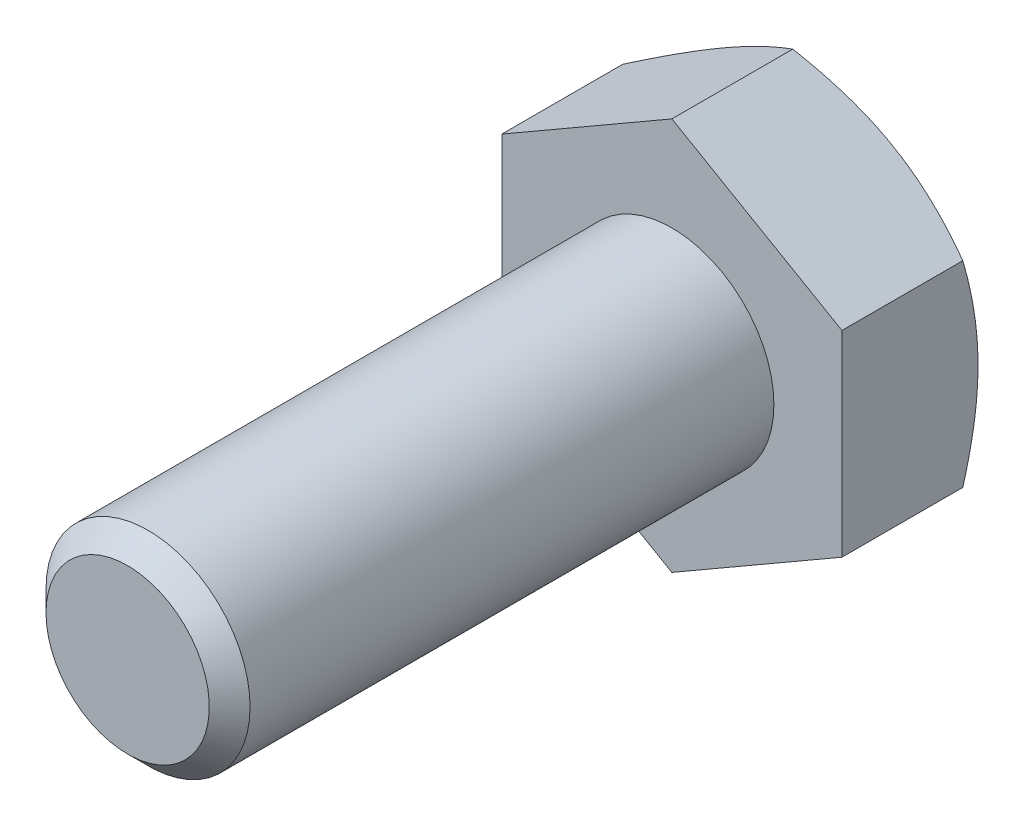
ISO-10303-21;
HEADER;
FILE_DESCRIPTION(('STEP AP214'),'2;1');
FILE_NAME('part.step','',(''),(''),'','','');
FILE_SCHEMA(('AUTOMOTIVE_DESIGN { 1 0 10303 214 1 1 1 1 }'));
ENDSEC;
DATA;
#1=APPLICATION_CONTEXT('core data for automotive mechanical design processes');
#2=APPLICATION_PROTOCOL_DEFINITION('international standard','automotive_design',2000,#1);
#3=PRODUCT_CONTEXT('',#1,'mechanical');
#4=PRODUCT('Part','Part','',(#3));
#5=PRODUCT_RELATED_PRODUCT_CATEGORY('part','',(#4));
#6=PRODUCT_DEFINITION_FORMATION('','',#4);
#7=PRODUCT_DEFINITION_CONTEXT('part definition',#1,'design');
#8=PRODUCT_DEFINITION('design','',#6,#7);
#9=PRODUCT_DEFINITION_SHAPE('','',#8);
#10=(LENGTH_UNIT() NAMED_UNIT(*) SI_UNIT(.MILLI.,.METRE.));
#11=(NAMED_UNIT(*) PLANE_ANGLE_UNIT() SI_UNIT($,.RADIAN.));
#12=(NAMED_UNIT(*) SI_UNIT($,.STERADIAN.) SOLID_ANGLE_UNIT());
#13=UNCERTAINTY_MEASURE_WITH_UNIT(LENGTH_MEASURE(1.E-05),#10,'distance_accuracy_value','');
#14=(GEOMETRIC_REPRESENTATION_CONTEXT(3) GLOBAL_UNCERTAINTY_ASSIGNED_CONTEXT((#13)) GLOBAL_UNIT_ASSIGNED_CONTEXT((#10,
#11,#12)) REPRESENTATION_CONTEXT('',''));
#15=CARTESIAN_POINT('',(0.,0.,0.));
#16=DIRECTION('',(0.,0.,1.));
#17=DIRECTION('',(1.,0.,0.));
#18=AXIS2_PLACEMENT_3D('',#15,#16,#17);
#19=CARTESIAN_POINT('',(0.,0.,16.));
#20=DIRECTION('',(0.,0.,1.));
#21=DIRECTION('',(1.,0.,0.));
#22=AXIS2_PLACEMENT_3D('',#19,#20,#21);
#23=PLANE('',#22);
#24=CARTESIAN_POINT('',(0.,0.,16.));
#25=DIRECTION('',(0.,0.,1.));
#26=DIRECTION('',(1.,0.,0.));
#27=AXIS2_PLACEMENT_3D('',#24,#25,#26);
#28=CIRCLE('',#27,2.4);
#29=CARTESIAN_POINT('',(-2.4,0.,16.));
#30=VERTEX_POINT('',#29);
#31=EDGE_CURVE('E215',#30,#30,#28,.T.);
#32=ORIENTED_EDGE('',*,*,#31,.T.);
#33=EDGE_LOOP('',(#32));
#34=FACE_BOUND('',#33,.T.);
#35=ADVANCED_FACE('F35',(#34),#23,.T.);
#36=CARTESIAN_POINT('',(0.,0.,0.));
#37=DIRECTION('',(0.,0.,1.));
#38=DIRECTION('',(1.,0.,0.));
#39=AXIS2_PLACEMENT_3D('',#36,#37,#38);
#40=CYLINDRICAL_SURFACE('',#39,3.);
#41=CARTESIAN_POINT('',(0.,0.,15.4));
#42=DIRECTION('',(0.,0.,1.));
#43=DIRECTION('',(1.,0.,0.));
#44=AXIS2_PLACEMENT_3D('',#41,#42,#43);
#45=CIRCLE('',#44,3.);
#46=CARTESIAN_POINT('',(-3.,0.,15.4));
#47=VERTEX_POINT('',#46);
#48=EDGE_CURVE('E217',#47,#47,#45,.F.);
#49=ORIENTED_EDGE('',*,*,#48,.T.);
#50=EDGE_LOOP('',(#49));
#51=FACE_BOUND('',#50,.T.);
#52=CARTESIAN_POINT('',(0.,0.,0.));
#53=DIRECTION('',(0.,0.,1.));
#54=DIRECTION('',(1.,0.,0.));
#55=AXIS2_PLACEMENT_3D('',#52,#53,#54);
#56=CIRCLE('',#55,3.);
#57=CARTESIAN_POINT('',(3.,0.,0.));
#58=VERTEX_POINT('',#57);
#59=EDGE_CURVE('E218',#58,#58,#56,.F.);
#60=ORIENTED_EDGE('',*,*,#59,.F.);
#61=EDGE_LOOP('',(#60));
#62=FACE_BOUND('',#61,.T.);
#63=ADVANCED_FACE('F206',(#51,#62),#40,.T.);
#64=CARTESIAN_POINT('',(0.,0.,16.));
#65=DIRECTION('',(0.,0.,-1.));
#66=DIRECTION('',(-1.,0.,0.));
#67=AXIS2_PLACEMENT_3D('',#64,#65,#66);
#68=CONICAL_SURFACE('',#67,2.4,0.785398163397446);
#69=CARTESIAN_POINT('',(-3.,0.,15.4));
#70=CARTESIAN_POINT('',(-2.99375,0.,15.40625));
#71=CARTESIAN_POINT('',(-2.9875,0.,15.4125));
#72=CARTESIAN_POINT('',(-2.975,0.,15.425));
#73=CARTESIAN_POINT('',(-2.96875,0.,15.43125));
#74=CARTESIAN_POINT('',(-2.95625,0.,15.44375));
#75=CARTESIAN_POINT('',(-2.95,0.,15.45));
#76=CARTESIAN_POINT('',(-2.9375,0.,15.4625));
#77=CARTESIAN_POINT('',(-2.93125,0.,15.46875));
#78=CARTESIAN_POINT('',(-2.91875,0.,15.48125));
#79=CARTESIAN_POINT('',(-2.9125,0.,15.4875));
#80=CARTESIAN_POINT('',(-2.9,0.,15.5));
#81=CARTESIAN_POINT('',(-2.89375,0.,15.50625));
#82=CARTESIAN_POINT('',(-2.88125,0.,15.51875));
#83=CARTESIAN_POINT('',(-2.875,0.,15.525));
#84=CARTESIAN_POINT('',(-2.8625,0.,15.5375));
#85=CARTESIAN_POINT('',(-2.85625,0.,15.54375));
#86=CARTESIAN_POINT('',(-2.84375,0.,15.55625));
#87=CARTESIAN_POINT('',(-2.8375,0.,15.5625));
#88=CARTESIAN_POINT('',(-2.825,0.,15.575));
#89=CARTESIAN_POINT('',(-2.81875,0.,15.58125));
#90=CARTESIAN_POINT('',(-2.80625,0.,15.59375));
#91=CARTESIAN_POINT('',(-2.8,0.,15.6));
#92=CARTESIAN_POINT('',(-2.7875,0.,15.6125));
#93=CARTESIAN_POINT('',(-2.78125,0.,15.61875));
#94=CARTESIAN_POINT('',(-2.76875,0.,15.63125));
#95=CARTESIAN_POINT('',(-2.7625,0.,15.6375));
#96=CARTESIAN_POINT('',(-2.75,0.,15.65));
#97=CARTESIAN_POINT('',(-2.74375,0.,15.65625));
#98=CARTESIAN_POINT('',(-2.73125,0.,15.66875));
#99=CARTESIAN_POINT('',(-2.725,0.,15.675));
#100=CARTESIAN_POINT('',(-2.7125,0.,15.6875));
#101=CARTESIAN_POINT('',(-2.70625,0.,15.69375));
#102=CARTESIAN_POINT('',(-2.69375,0.,15.70625));
#103=CARTESIAN_POINT('',(-2.6875,0.,15.7125));
#104=CARTESIAN_POINT('',(-2.675,0.,15.725));
#105=CARTESIAN_POINT('',(-2.66875,0.,15.73125));
#106=CARTESIAN_POINT('',(-2.65625,0.,15.74375));
#107=CARTESIAN_POINT('',(-2.65,0.,15.75));
#108=CARTESIAN_POINT('',(-2.6375,0.,15.7625));
#109=CARTESIAN_POINT('',(-2.63125,0.,15.76875));
#110=CARTESIAN_POINT('',(-2.61875,0.,15.78125));
#111=CARTESIAN_POINT('',(-2.6125,0.,15.7875));
#112=CARTESIAN_POINT('',(-2.6,0.,15.8));
#113=CARTESIAN_POINT('',(-2.59375,0.,15.80625));
#114=CARTESIAN_POINT('',(-2.58125,0.,15.81875));
#115=CARTESIAN_POINT('',(-2.575,0.,15.825));
#116=CARTESIAN_POINT('',(-2.5625,0.,15.8375));
#117=CARTESIAN_POINT('',(-2.55625,0.,15.84375));
#118=CARTESIAN_POINT('',(-2.54375,0.,15.85625));
#119=CARTESIAN_POINT('',(-2.5375,0.,15.8625));
#120=CARTESIAN_POINT('',(-2.525,0.,15.875));
#121=CARTESIAN_POINT('',(-2.51875,0.,15.88125));
#122=CARTESIAN_POINT('',(-2.50625,0.,15.89375));
#123=CARTESIAN_POINT('',(-2.5,0.,15.9));
#124=CARTESIAN_POINT('',(-2.4875,0.,15.9125));
#125=CARTESIAN_POINT('',(-2.48125,0.,15.91875));
#126=CARTESIAN_POINT('',(-2.46875,0.,15.93125));
#127=CARTESIAN_POINT('',(-2.4625,0.,15.9375));
#128=CARTESIAN_POINT('',(-2.45,0.,15.95));
#129=CARTESIAN_POINT('',(-2.44375,0.,15.95625));
#130=CARTESIAN_POINT('',(-2.43125,0.,15.96875));
#131=CARTESIAN_POINT('',(-2.425,0.,15.975));
#132=CARTESIAN_POINT('',(-2.4125,0.,15.9875));
#133=CARTESIAN_POINT('',(-2.40625,0.,15.99375));
#134=CARTESIAN_POINT('',(-2.4,0.,16.));
#135=B_SPLINE_CURVE_WITH_KNOTS('',3,(#69,#70,#71,#72,#73,#74,#75,#76,#77,#78,#79,#80,#81,#82,
#83,#84,#85,#86,#87,#88,#89,#90,#91,#92,#93,#94,#95,#96,#97,#98,#99,#100,#101,#102,#103,#104,
#105,#106,#107,#108,#109,#110,#111,#112,#113,#114,#115,#116,#117,#118,#119,#120,#121,#122,#123,
#124,#125,#126,#127,#128,#129,#130,#131,#132,#133,#134),.UNSPECIFIED.,.F.,.F.,(4,2,2,2,2,2,2,2,
2,2,2,2,2,2,2,2,2,2,2,2,2,2,2,2,2,2,2,2,2,2,2,2,4),(0.,0.0265165042944963,0.0530330085889917,
0.079549512883487,0.106066017177982,0.132582521472479,0.159099025766974,0.185615530061469,
0.212132034355965,0.238648538650461,0.265165042944957,0.291681547239452,0.318198051533947,
0.344714555828444,0.371231060122938,0.397747564417434,0.424264068711931,0.450780573006425,
0.477297077300921,0.503813581595415,0.530330085889912,0.556846590184409,0.583363094478903,
0.609879598773399,0.636396103067896,0.66291260736239,0.689429111656886,0.71594561595138,
0.742462120245877,0.768978624540374,0.795495128834868,0.822011633129364,0.848528137423858),.UNSPECIFIED.);
#136=EDGE_CURVE('BSEAM211',#47,#30,#135,.T.);
#137=ORIENTED_EDGE('',*,*,#48,.F.);
#138=ORIENTED_EDGE('',*,*,#31,.F.);
#139=ORIENTED_EDGE('',*,*,#136,.T.);
#140=ORIENTED_EDGE('',*,*,#136,.F.);
#141=EDGE_LOOP('',(#137,#139,#138,#140));
#142=FACE_BOUND('',#141,.T.);
#143=ADVANCED_FACE('F211',(#142),#68,.T.);
#144=CARTESIAN_POINT('',(0.,5.77350269189627,-4.));
#145=DIRECTION('',(0.499999999999998,0.86602540378444,0.));
#146=DIRECTION('',(-0.86602540378444,0.499999999999998,0.));
#147=AXIS2_PLACEMENT_3D('',#144,#145,#146);
#148=PLANE('',#147);
#149=CARTESIAN_POINT('',(-0.000200000000025221,5.77361816195011,-3.55335134394816));
#150=CARTESIAN_POINT('',(0.219534594525161,5.64675433465072,-3.62661343236236));
#151=CARTESIAN_POINT('',(0.441148584459558,5.51880543790591,-3.6932486780819));
#152=CARTESIAN_POINT('',(0.888213995453493,5.26069210252319,-3.80956100898919));
#153=CARTESIAN_POINT('',(1.11367335959075,5.13052307794722,-3.85919695008421));
#154=CARTESIAN_POINT('',(1.56183230522349,4.87177839004642,-3.9364489745813));
#155=CARTESIAN_POINT('',(1.78446209310418,4.74324302208388,-3.96457962171651));
#156=CARTESIAN_POINT('',(2.11918990184663,4.54998783160117,-3.98980507804632));
#157=CARTESIAN_POINT('',(2.23084219680505,4.48552534905129,-3.99538654023052));
#158=CARTESIAN_POINT('',(2.45424997067378,4.35654081066912,-4.00079778324853));
#159=CARTESIAN_POINT('',(2.5660054462903,4.29201875673851,-4.0006277417418));
#160=CARTESIAN_POINT('',(2.87218423085063,4.11524635305245,-3.99224636820796));
#161=CARTESIAN_POINT('',(3.0665060859672,4.00305457769147,-3.97817022810275));
#162=CARTESIAN_POINT('',(3.4538601019977,3.77941563226459,-3.93353474289057));
#163=CARTESIAN_POINT('',(3.64689090137156,3.6679692482842,-3.90296013985249));
#164=CARTESIAN_POINT('',(4.03502534247485,3.44387972423145,-3.82653150637883));
#165=CARTESIAN_POINT('',(4.23007999864173,3.33126486598681,-3.78035362112132));
#166=CARTESIAN_POINT('',(4.61728034535877,3.10771464157942,-3.67554820550806));
#167=CARTESIAN_POINT('',(4.80943099540809,2.99677641204848,-3.61694529656262));
#168=CARTESIAN_POINT('',(5.0002,2.8866358758943,-3.55335134394817));
#169=B_SPLINE_CURVE_WITH_KNOTS('',3,(#149,#150,#151,#152,#153,#154,#155,#156,#157,#158,#159,
#160,#161,#162,#163,#164,#165,#166,#167,#168),.UNSPECIFIED.,.F.,.F.,(4,2,2,2,2,2,2,2,2,4),(0.,
0.792555841363094,1.58701660053334,2.36181537487281,2.74884076077326,3.13585419177296,
3.80962362599681,4.48401723901191,5.17336882348931,5.86136694793728),.UNSPECIFIED.);
#170=CARTESIAN_POINT('',(0.,5.77350269189627,-3.55341801261479));
#171=VERTEX_POINT('',#170);
#172=CARTESIAN_POINT('',(2.49999999999999,4.3301270189222,-4.));
#173=VERTEX_POINT('',#172);
#174=EDGE_CURVE('E251',#171,#173,#169,.T.);
#175=ORIENTED_EDGE('',*,*,#174,.F.);
#176=DIRECTION('',(0.,0.,1.));
#177=VECTOR('',#176,1.);
#178=CARTESIAN_POINT('',(0.,5.77350269189627,-4.));
#179=LINE('',#178,#177);
#180=CARTESIAN_POINT('',(0.,5.77350269189627,0.));
#181=VERTEX_POINT('',#180);
#182=EDGE_CURVE('E225',#171,#181,#179,.T.);
#183=ORIENTED_EDGE('',*,*,#182,.T.);
#184=DIRECTION('',(-0.86602540378444,0.499999999999998,0.));
#185=VECTOR('',#184,1.);
#186=CARTESIAN_POINT('',(0.,5.77350269189627,0.));
#187=LINE('',#186,#185);
#188=CARTESIAN_POINT('',(5.,2.88675134594814,0.));
#189=VERTEX_POINT('',#188);
#190=EDGE_CURVE('E249',#189,#181,#187,.T.);
#191=ORIENTED_EDGE('',*,*,#190,.F.);
#192=DIRECTION('',(0.,0.,1.));
#193=VECTOR('',#192,1.);
#194=CARTESIAN_POINT('',(5.,2.88675134594814,-4.));
#195=LINE('',#194,#193);
#196=CARTESIAN_POINT('',(5.,2.88675134594814,-3.55341801261479));
#197=VERTEX_POINT('',#196);
#198=EDGE_CURVE('E222',#197,#189,#195,.T.);
#199=ORIENTED_EDGE('',*,*,#198,.F.);
#200=EDGE_CURVE('E179',#173,#197,#169,.T.);
#201=ORIENTED_EDGE('',*,*,#200,.F.);
#202=EDGE_LOOP('',(#175,#183,#191,#199,#201));
#203=FACE_BOUND('',#202,.T.);
#204=ADVANCED_FACE('F190',(#203),#148,.T.);
#205=CARTESIAN_POINT('',(5.,-2.88675134594814,-4.));
#206=DIRECTION('',(1.,0.,0.));
#207=DIRECTION('',(0.,0.,-1.));
#208=AXIS2_PLACEMENT_3D('',#205,#206,#207);
#209=PLANE('',#208);
#210=CARTESIAN_POINT('',(5.,-7.87365701887671,-1.5017575406002));
#211=CARTESIAN_POINT('',(5.,-7.65421637408503,-1.60868091551638));
#212=CARTESIAN_POINT('',(5.,-7.43428458635669,-1.71461296428863));
#213=CARTESIAN_POINT('',(5.,-6.99317792778183,-1.92393906972984));
#214=CARTESIAN_POINT('',(5.,-6.77200287775448,-2.02733274840781));
#215=CARTESIAN_POINT('',(5.,-6.32706593086418,-2.23152152372063));
#216=CARTESIAN_POINT('',(5.,-6.10329657096096,-2.3323004121857));
#217=CARTESIAN_POINT('',(5.,-5.65401907662693,-2.52988978310134));
#218=CARTESIAN_POINT('',(5.,-5.42851102159106,-2.62670044549485));
#219=CARTESIAN_POINT('',(5.,-4.96773019079146,-2.81850105982912));
#220=CARTESIAN_POINT('',(5.,-4.73238523141452,-2.91331851381281));
#221=CARTESIAN_POINT('',(5.,-4.2589865047372,-3.09606229826896));
#222=CARTESIAN_POINT('',(5.,-4.02093244346305,-3.18398787255528));
#223=CARTESIAN_POINT('',(5.,-3.54214478748225,-3.35072723495475));
#224=CARTESIAN_POINT('',(5.,-3.301417327683,-3.42955846793331));
#225=CARTESIAN_POINT('',(5.,-2.81651125773827,-3.57565910984207));
#226=CARTESIAN_POINT('',(5.,-2.57233372177781,-3.64293203520484));
#227=CARTESIAN_POINT('',(5.,-2.08173956311768,-3.7624103830642));
#228=CARTESIAN_POINT('',(5.,-1.83534384469815,-3.81470009598878));
#229=CARTESIAN_POINT('',(5.,-1.33936717869396,-3.90133365164022));
#230=CARTESIAN_POINT('',(5.,-1.08978658051681,-3.93567944591482));
#231=CARTESIAN_POINT('',(5.,-0.591994652611084,-3.98324171552745));
#232=CARTESIAN_POINT('',(5.,-0.343810846499261,-3.99673913454035));
#233=CARTESIAN_POINT('',(5.,0.152820514821982,-4.00220795227787));
#234=CARTESIAN_POINT('',(5.,0.401268073866003,-3.99417903363378));
#235=CARTESIAN_POINT('',(5.,0.819539614676472,-3.96311999213591));
#236=CARTESIAN_POINT('',(5.,0.989794934045115,-3.94552930521965));
#237=CARTESIAN_POINT('',(5.,1.32912938793637,-3.90127081793362));
#238=CARTESIAN_POINT('',(5.,1.4982083730453,-3.87460188520701));
#239=CARTESIAN_POINT('',(5.,2.00341173301728,-3.78237229170764));
#240=CARTESIAN_POINT('',(5.,2.33733597588798,-3.7046029071478));
#241=CARTESIAN_POINT('',(5.,2.83691487199412,-3.56883106598623));
#242=CARTESIAN_POINT('',(5.,3.00513229800651,-3.51971360302847));
#243=CARTESIAN_POINT('',(5.,3.33993504452564,-3.41615110534968));
#244=CARTESIAN_POINT('',(5.,3.50652035243128,-3.36170602953137));
#245=CARTESIAN_POINT('',(5.,3.83810926585562,-3.24838071200457));
#246=CARTESIAN_POINT('',(5.,4.00311330167853,-3.18950171787468));
#247=CARTESIAN_POINT('',(5.,4.33173746060673,-3.06802383137711));
#248=CARTESIAN_POINT('',(5.,4.49535761540593,-3.00542502446628));
#249=CARTESIAN_POINT('',(5.,4.93598294300641,-2.83201950467008));
#250=CARTESIAN_POINT('',(5.,5.21182602366739,-2.71826266901746));
#251=CARTESIAN_POINT('',(5.,5.76066658468264,-2.48405585630304));
#252=CARTESIAN_POINT('',(5.,6.03366374395565,-2.36360513352739));
#253=CARTESIAN_POINT('',(5.,6.57746623823238,-2.11759609543005));
#254=CARTESIAN_POINT('',(5.,6.84827068606624,-1.99203582558467));
#255=CARTESIAN_POINT('',(5.,7.38802449320273,-1.73703058830432));
#256=CARTESIAN_POINT('',(5.,7.65697392790876,-1.60758577992801));
#257=CARTESIAN_POINT('',(5.,8.19381940264888,-1.34544789623685));
#258=CARTESIAN_POINT('',(5.,8.46171304378484,-1.21274991821136));
#259=CARTESIAN_POINT('',(5.,8.99628800444126,-0.944933092450972));
#260=CARTESIAN_POINT('',(5.,9.2629693137911,-0.809814224453294));
#261=CARTESIAN_POINT('',(5.,10.0614145317377,-0.40162739601699));
#262=CARTESIAN_POINT('',(5.,10.5917004378745,-0.125669691034931));
#263=CARTESIAN_POINT('',(5.,11.5934978261983,0.40186932093091));
#264=CARTESIAN_POINT('',(5.,12.0652823432174,0.652934653119654));
#265=CARTESIAN_POINT('',(5.,13.0072652089827,1.1580917437192));
#266=CARTESIAN_POINT('',(5.,13.4774634574011,1.41218368911637));
#267=CARTESIAN_POINT('',(5.,14.4150598997455,1.92174727964072));
#268=CARTESIAN_POINT('',(5.,14.8824621908533,2.17721139782642));
#269=CARTESIAN_POINT('',(5.,15.8162766578094,2.68985606252671));
#270=CARTESIAN_POINT('',(5.,16.2826889092875,2.94703647122068));
#271=CARTESIAN_POINT('',(5.,16.7487534511426,3.20484156047919));
#272=B_SPLINE_CURVE_WITH_KNOTS('',3,(#210,#211,#212,#213,#214,#215,#216,#217,#218,#219,#220,
#221,#222,#223,#224,#225,#226,#227,#228,#229,#230,#231,#232,#233,#234,#235,#236,#237,#238,#239,
#240,#241,#242,#243,#244,#245,#246,#247,#248,#249,#250,#251,#252,#253,#254,#255,#256,#257,#258,
#259,#260,#261,#262,#263,#264,#265,#266,#267,#268,#269,#270,#271),.UNSPECIFIED.,.F.,.F.,(4,2,2,
2,2,2,2,2,2,2,2,2,2,2,2,2,2,2,2,2,2,2,2,2,2,2,2,2,2,2,4),(0.,0.732320649228784,1.46474969554234,
2.20096737715445,2.93715163726605,3.69825037836022,4.45943251165486,5.2191293658807,
5.97859468349109,6.73369963721939,7.48872245001085,8.23347928786151,8.97824710592679,
9.49148539016024,10.0047877156168,11.0318914624583,11.5575684291884,12.0832494513179,
12.6087831104645,13.1343047009664,14.0293094369911,14.9244140791771,15.819864399481,
16.7152781040304,17.612136124032,18.5090016542186,20.3023290058613,21.9056050637106,
23.5089806922305,25.106957271978,26.7048070399876),.UNSPECIFIED.);
#273=CARTESIAN_POINT('',(5.,0.,-4.));
#274=VERTEX_POINT('',#273);
#275=EDGE_CURVE('E177',#197,#274,#272,.F.);
#276=ORIENTED_EDGE('',*,*,#275,.F.);
#277=ORIENTED_EDGE('',*,*,#198,.T.);
#278=DIRECTION('',(0.,1.,0.));
#279=VECTOR('',#278,1.);
#280=CARTESIAN_POINT('',(5.,-2.88675134594814,0.));
#281=LINE('',#280,#279);
#282=CARTESIAN_POINT('',(5.,-2.88675134594814,0.));
#283=VERTEX_POINT('',#282);
#284=EDGE_CURVE('E227',#283,#189,#281,.T.);
#285=ORIENTED_EDGE('',*,*,#284,.F.);
#286=DIRECTION('',(0.,0.,1.));
#287=VECTOR('',#286,1.);
#288=CARTESIAN_POINT('',(5.,-2.88675134594814,-4.));
#289=LINE('',#288,#287);
#290=CARTESIAN_POINT('',(5.,-2.88675134594814,-3.55341801261479));
#291=VERTEX_POINT('',#290);
#292=EDGE_CURVE('E233',#291,#283,#289,.T.);
#293=ORIENTED_EDGE('',*,*,#292,.F.);
#294=EDGE_CURVE('E171',#274,#291,#272,.F.);
#295=ORIENTED_EDGE('',*,*,#294,.F.);
#296=EDGE_LOOP('',(#276,#277,#285,#293,#295));
#297=FACE_BOUND('',#296,.T.);
#298=ADVANCED_FACE('F186',(#297),#209,.T.);
#299=CARTESIAN_POINT('',(0.,-5.77350269189627,-4.));
#300=DIRECTION('',(0.499999999999998,-0.86602540378444,0.));
#301=DIRECTION('',(0.86602540378444,0.499999999999998,0.));
#302=AXIS2_PLACEMENT_3D('',#299,#300,#301);
#303=PLANE('',#302);
#304=CARTESIAN_POINT('',(5.0002,-2.8866358758943,-3.55335134394816));
#305=CARTESIAN_POINT('',(4.78046540547482,-3.01349970319369,-3.62661343236236));
#306=CARTESIAN_POINT('',(4.55885141554042,-3.1414485999385,-3.6932486780819));
#307=CARTESIAN_POINT('',(4.11178600454649,-3.39956193532122,-3.80956100898919));
#308=CARTESIAN_POINT('',(3.88632664040922,-3.52973095989719,-3.85919695008421));
#309=CARTESIAN_POINT('',(3.43816769477649,-3.78847564779799,-3.9364489745813));
#310=CARTESIAN_POINT('',(3.2155379068958,-3.91701101576053,-3.96457962171651));
#311=CARTESIAN_POINT('',(2.88081009815335,-4.11026620624323,-3.98980507804631));
#312=CARTESIAN_POINT('',(2.76915780319493,-4.17472868879312,-3.99538654023052));
#313=CARTESIAN_POINT('',(2.54575002932619,-4.30371322717529,-4.00079778324853));
#314=CARTESIAN_POINT('',(2.43399455370968,-4.3682352811059,-4.0006277417418));
#315=CARTESIAN_POINT('',(2.12781576914935,-4.54500768479195,-3.99224636820796));
#316=CARTESIAN_POINT('',(1.93349391403277,-4.65719946015293,-3.97817022810275));
#317=CARTESIAN_POINT('',(1.54613989800228,-4.88083840557982,-3.93353474289057));
#318=CARTESIAN_POINT('',(1.35310909862841,-4.99228478956021,-3.90296013985249));
#319=CARTESIAN_POINT('',(0.964974657525127,-5.21637431361296,-3.82653150637883));
#320=CARTESIAN_POINT('',(0.769920001358244,-5.3289891718576,-3.78035362112132));
#321=CARTESIAN_POINT('',(0.382719654641209,-5.55253939626499,-3.67554820550806));
#322=CARTESIAN_POINT('',(0.190569004591889,-5.66347762579593,-3.61694529656262));
#323=CARTESIAN_POINT('',(-0.000200000000025032,-5.77361816195011,-3.55335134394816));
#324=B_SPLINE_CURVE_WITH_KNOTS('',3,(#304,#305,#306,#307,#308,#309,#310,#311,#312,#313,#314,
#315,#316,#317,#318,#319,#320,#321,#322,#323),.UNSPECIFIED.,.F.,.F.,(4,2,2,2,2,2,2,2,2,4),(0.,
0.792555841363094,1.58701660053334,2.36181537487281,2.74884076077326,3.13585419177296,
3.8096236259968,4.48401723901191,5.17336882348931,5.86136694793728),.UNSPECIFIED.);
#325=CARTESIAN_POINT('',(2.49999999999999,-4.3301270189222,-4.));
#326=VERTEX_POINT('',#325);
#327=EDGE_CURVE('E178',#291,#326,#324,.T.);
#328=ORIENTED_EDGE('',*,*,#327,.F.);
#329=ORIENTED_EDGE('',*,*,#292,.T.);
#330=DIRECTION('',(0.86602540378444,0.499999999999998,0.));
#331=VECTOR('',#330,1.);
#332=CARTESIAN_POINT('',(0.,-5.77350269189627,0.));
#333=LINE('',#332,#331);
#334=CARTESIAN_POINT('',(0.,-5.77350269189627,0.));
#335=VERTEX_POINT('',#334);
#336=EDGE_CURVE('E238',#335,#283,#333,.T.);
#337=ORIENTED_EDGE('',*,*,#336,.F.);
#338=DIRECTION('',(0.,0.,1.));
#339=VECTOR('',#338,1.);
#340=CARTESIAN_POINT('',(0.,-5.77350269189627,-4.));
#341=LINE('',#340,#339);
#342=CARTESIAN_POINT('',(0.,-5.77350269189627,-3.55341801261479));
#343=VERTEX_POINT('',#342);
#344=EDGE_CURVE('E231',#343,#335,#341,.T.);
#345=ORIENTED_EDGE('',*,*,#344,.F.);
#346=EDGE_CURVE('E164',#326,#343,#324,.T.);
#347=ORIENTED_EDGE('',*,*,#346,.F.);
#348=EDGE_LOOP('',(#328,#329,#337,#345,#347));
#349=FACE_BOUND('',#348,.T.);
#350=ADVANCED_FACE('F189',(#349),#303,.T.);
#351=CARTESIAN_POINT('',(0.,-5.77350269189627,-4.));
#352=DIRECTION('',(-0.500000000000002,-0.866025403784438,0.));
#353=DIRECTION('',(0.866025403784438,-0.500000000000002,0.));
#354=AXIS2_PLACEMENT_3D('',#351,#352,#353);
#355=PLANE('',#354);
#356=CARTESIAN_POINT('',(0.000199999999974914,-5.77361816195011,-3.55335134394816));
#357=CARTESIAN_POINT('',(-0.219534594525211,-5.64675433465072,-3.62661343236236));
#358=CARTESIAN_POINT('',(-0.441148584459607,-5.5188054379059,-3.6932486780819));
#359=CARTESIAN_POINT('',(-0.88821399545354,-5.26069210252319,-3.80956100898918));
#360=CARTESIAN_POINT('',(-1.1136733595908,-5.13052307794722,-3.85919695008421));
#361=CARTESIAN_POINT('',(-1.56183230522354,-4.87177839004641,-3.9364489745813));
#362=CARTESIAN_POINT('',(-1.78446209310422,-4.74324302208387,-3.96457962171651));
#363=CARTESIAN_POINT('',(-2.11918990184667,-4.54998783160116,-3.98980507804631));
#364=CARTESIAN_POINT('',(-2.23084219680509,-4.48552534905128,-3.99538654023051));
#365=CARTESIAN_POINT('',(-2.45424997067383,-4.35654081066911,-4.00079778324852));
#366=CARTESIAN_POINT('',(-2.56600544629034,-4.2920187567385,-4.00062774174179));
#367=CARTESIAN_POINT('',(-2.87218423085067,-4.11524635305245,-3.99224636820795));
#368=CARTESIAN_POINT('',(-3.06650608596724,-4.00305457769146,-3.97817022810274));
#369=CARTESIAN_POINT('',(-3.45386010199773,-3.77941563226458,-3.93353474289056));
#370=CARTESIAN_POINT('',(-3.64689090137159,-3.66796924828419,-3.90296013985248));
#371=CARTESIAN_POINT('',(-4.03502534247487,-3.44387972423144,-3.82653150637883));
#372=CARTESIAN_POINT('',(-4.23007999864175,-3.33126486598681,-3.78035362112131));
#373=CARTESIAN_POINT('',(-4.61728034535878,-3.10771464157941,-3.67554820550806));
#374=CARTESIAN_POINT('',(-4.80943099540809,-2.99677641204848,-3.61694529656262));
#375=CARTESIAN_POINT('',(-5.0002,-2.8866358758943,-3.55335134394817));
#376=B_SPLINE_CURVE_WITH_KNOTS('',3,(#356,#357,#358,#359,#360,#361,#362,#363,#364,#365,#366,
#367,#368,#369,#370,#371,#372,#373,#374,#375),.UNSPECIFIED.,.F.,.F.,(4,2,2,2,2,2,2,2,2,4),(0.,
0.792555841363093,1.58701660053334,2.36181537487281,2.74884076077326,3.13585419177296,
3.80962362599679,4.48401723901189,5.17336882348927,5.86136694793723),.UNSPECIFIED.);
#377=CARTESIAN_POINT('',(-2.50000000000001,-4.33012701892219,-4.));
#378=VERTEX_POINT('',#377);
#379=EDGE_CURVE('E270',#343,#378,#376,.T.);
#380=ORIENTED_EDGE('',*,*,#379,.F.);
#381=ORIENTED_EDGE('',*,*,#344,.T.);
#382=DIRECTION('',(0.866025403784438,-0.500000000000002,0.));
#383=VECTOR('',#382,1.);
#384=CARTESIAN_POINT('',(0.,-5.77350269189627,0.));
#385=LINE('',#384,#383);
#386=CARTESIAN_POINT('',(-5.,-2.88675134594814,0.));
#387=VERTEX_POINT('',#386);
#388=EDGE_CURVE('E241',#387,#335,#385,.T.);
#389=ORIENTED_EDGE('',*,*,#388,.F.);
#390=DIRECTION('',(0.,0.,1.));
#391=VECTOR('',#390,1.);
#392=CARTESIAN_POINT('',(-5.,-2.88675134594814,-4.));
#393=LINE('',#392,#391);
#394=CARTESIAN_POINT('',(-5.,-2.88675134594837,-3.55341801261495));
#395=VERTEX_POINT('',#394);
#396=EDGE_CURVE('E229',#395,#387,#393,.T.);
#397=ORIENTED_EDGE('',*,*,#396,.F.);
#398=EDGE_CURVE('E111',#378,#395,#376,.T.);
#399=ORIENTED_EDGE('',*,*,#398,.F.);
#400=EDGE_LOOP('',(#380,#381,#389,#397,#399));
#401=FACE_BOUND('',#400,.T.);
#402=ADVANCED_FACE('F195',(#401),#355,.T.);
#403=CARTESIAN_POINT('',(-5.,-2.88675134594814,-4.));
#404=DIRECTION('',(-1.,0.,0.));
#405=DIRECTION('',(0.,0.,1.));
#406=AXIS2_PLACEMENT_3D('',#403,#404,#405);
#407=PLANE('',#406);
#408=CARTESIAN_POINT('',(-5.,-7.87365701887671,-1.5017575406002));
#409=CARTESIAN_POINT('',(-5.,-7.65421637408503,-1.60868091551638));
#410=CARTESIAN_POINT('',(-5.,-7.43428458635668,-1.71461296428863));
#411=CARTESIAN_POINT('',(-5.,-6.99317792778183,-1.92393906972984));
#412=CARTESIAN_POINT('',(-5.,-6.77200287775447,-2.02733274840781));
#413=CARTESIAN_POINT('',(-5.,-6.32706593086418,-2.23152152372063));
#414=CARTESIAN_POINT('',(-5.,-6.10329657096096,-2.3323004121857));
#415=CARTESIAN_POINT('',(-5.,-5.65401907662693,-2.52988978310134));
#416=CARTESIAN_POINT('',(-5.,-5.42851102159105,-2.62670044549485));
#417=CARTESIAN_POINT('',(-5.,-4.96773019079146,-2.81850105982912));
#418=CARTESIAN_POINT('',(-5.,-4.73238523141451,-2.91331851381281));
#419=CARTESIAN_POINT('',(-5.,-4.2589865047372,-3.09606229826896));
#420=CARTESIAN_POINT('',(-5.,-4.02093244346305,-3.18398787255528));
#421=CARTESIAN_POINT('',(-5.,-3.54214478748225,-3.35072723495475));
#422=CARTESIAN_POINT('',(-5.,-3.301417327683,-3.42955846793331));
#423=CARTESIAN_POINT('',(-5.,-2.81651125773827,-3.57565910984207));
#424=CARTESIAN_POINT('',(-5.,-2.57233372177781,-3.64293203520484));
#425=CARTESIAN_POINT('',(-5.,-2.08173956311767,-3.7624103830642));
#426=CARTESIAN_POINT('',(-5.,-1.83534384469815,-3.81470009598878));
#427=CARTESIAN_POINT('',(-5.,-1.33936717869396,-3.90133365164022));
#428=CARTESIAN_POINT('',(-5.,-1.08978658051681,-3.93567944591482));
#429=CARTESIAN_POINT('',(-5.,-0.591994652611084,-3.98324171552745));
#430=CARTESIAN_POINT('',(-5.,-0.343810846499262,-3.99673913454035));
#431=CARTESIAN_POINT('',(-5.,0.152820514821981,-4.00220795227786));
#432=CARTESIAN_POINT('',(-5.,0.401268073866001,-3.99417903363377));
#433=CARTESIAN_POINT('',(-5.,0.819539614676471,-3.96311999213591));
#434=CARTESIAN_POINT('',(-5.,0.989794934045114,-3.94552930521965));
#435=CARTESIAN_POINT('',(-5.,1.32912938793637,-3.90127081793362));
#436=CARTESIAN_POINT('',(-5.,1.49820837304529,-3.87460188520701));
#437=CARTESIAN_POINT('',(-5.,2.00341173301727,-3.78237229170764));
#438=CARTESIAN_POINT('',(-5.,2.33733597588798,-3.7046029071478));
#439=CARTESIAN_POINT('',(-5.,2.83691487199412,-3.56883106598623));
#440=CARTESIAN_POINT('',(-5.,3.00513229800651,-3.51971360302847));
#441=CARTESIAN_POINT('',(-5.,3.33993504452563,-3.41615110534968));
#442=CARTESIAN_POINT('',(-5.,3.50652035243127,-3.36170602953137));
#443=CARTESIAN_POINT('',(-5.,3.83810926585562,-3.24838071200456));
#444=CARTESIAN_POINT('',(-5.,4.00311330167853,-3.18950171787468));
#445=CARTESIAN_POINT('',(-5.,4.33173746060672,-3.06802383137711));
#446=CARTESIAN_POINT('',(-5.,4.49535761540593,-3.00542502446628));
#447=CARTESIAN_POINT('',(-5.,4.93598294300641,-2.83201950467008));
#448=CARTESIAN_POINT('',(-5.,5.21182602366738,-2.71826266901746));
#449=CARTESIAN_POINT('',(-5.,5.76066658468263,-2.48405585630305));
#450=CARTESIAN_POINT('',(-5.,6.03366374395565,-2.36360513352739));
#451=CARTESIAN_POINT('',(-5.,6.57746623823238,-2.11759609543005));
#452=CARTESIAN_POINT('',(-5.,6.84827068606623,-1.99203582558467));
#453=CARTESIAN_POINT('',(-5.,7.38802449320272,-1.73703058830433));
#454=CARTESIAN_POINT('',(-5.,7.65697392790876,-1.60758577992802));
#455=CARTESIAN_POINT('',(-5.,8.19381940264887,-1.34544789623686));
#456=CARTESIAN_POINT('',(-5.,8.46171304378483,-1.21274991821137));
#457=CARTESIAN_POINT('',(-5.,8.99628800444126,-0.944933092450974));
#458=CARTESIAN_POINT('',(-5.,9.26296931379109,-0.809814224453296));
#459=CARTESIAN_POINT('',(-5.,10.0614145317377,-0.401627396016992));
#460=CARTESIAN_POINT('',(-5.,10.5917004378745,-0.125669691034933));
#461=CARTESIAN_POINT('',(-5.,11.5934978261983,0.401869320930909));
#462=CARTESIAN_POINT('',(-5.,12.0652823432174,0.652934653119654));
#463=CARTESIAN_POINT('',(-5.,13.0072652089827,1.1580917437192));
#464=CARTESIAN_POINT('',(-5.,13.4774634574011,1.41218368911637));
#465=CARTESIAN_POINT('',(-5.,14.4150598997455,1.92174727964072));
#466=CARTESIAN_POINT('',(-5.,14.8824621908533,2.17721139782642));
#467=CARTESIAN_POINT('',(-5.,15.8162766578094,2.68985606252671));
#468=CARTESIAN_POINT('',(-5.,16.2826889092875,2.94703647122068));
#469=CARTESIAN_POINT('',(-5.,16.7487534511426,3.20484156047919));
#470=B_SPLINE_CURVE_WITH_KNOTS('',3,(#408,#409,#410,#411,#412,#413,#414,#415,#416,#417,#418,
#419,#420,#421,#422,#423,#424,#425,#426,#427,#428,#429,#430,#431,#432,#433,#434,#435,#436,#437,
#438,#439,#440,#441,#442,#443,#444,#445,#446,#447,#448,#449,#450,#451,#452,#453,#454,#455,#456,
#457,#458,#459,#460,#461,#462,#463,#464,#465,#466,#467,#468,#469),.UNSPECIFIED.,.F.,.F.,(4,2,2,
2,2,2,2,2,2,2,2,2,2,2,2,2,2,2,2,2,2,2,2,2,2,2,2,2,2,2,4),(0.,0.732320649228783,1.46474969554234,
2.20096737715445,2.93715163726605,3.69825037836022,4.45943251165486,5.2191293658807,
5.97859468349108,6.73369963721939,7.48872245001085,8.2334792878615,8.97824710592679,
9.49148539016023,10.0047877156168,11.0318914624583,11.5575684291884,12.0832494513179,
12.6087831104645,13.1343047009664,14.0293094369911,14.9244140791771,15.819864399481,
16.7152781040304,17.612136124032,18.5090016542186,20.3023290058613,21.9056050637106,
23.5089806922305,25.106957271978,26.7048070399876),.UNSPECIFIED.);
#471=CARTESIAN_POINT('',(-5.,0.,-4.));
#472=VERTEX_POINT('',#471);
#473=EDGE_CURVE('E106',#395,#472,#470,.T.);
#474=ORIENTED_EDGE('',*,*,#473,.F.);
#475=ORIENTED_EDGE('',*,*,#396,.T.);
#476=DIRECTION('',(0.,-1.,0.));
#477=VECTOR('',#476,1.);
#478=CARTESIAN_POINT('',(-5.,-2.88675134594814,0.));
#479=LINE('',#478,#477);
#480=CARTESIAN_POINT('',(-5.,2.88675134594814,0.));
#481=VERTEX_POINT('',#480);
#482=EDGE_CURVE('E244',#481,#387,#479,.T.);
#483=ORIENTED_EDGE('',*,*,#482,.F.);
#484=DIRECTION('',(0.,0.,1.));
#485=VECTOR('',#484,1.);
#486=CARTESIAN_POINT('',(-5.,2.88675134594814,-4.));
#487=LINE('',#486,#485);
#488=CARTESIAN_POINT('',(-5.,2.88675134594814,-3.55341801261479));
#489=VERTEX_POINT('',#488);
#490=EDGE_CURVE('E132',#489,#481,#487,.T.);
#491=ORIENTED_EDGE('',*,*,#490,.F.);
#492=EDGE_CURVE('E115',#472,#489,#470,.T.);
#493=ORIENTED_EDGE('',*,*,#492,.F.);
#494=EDGE_LOOP('',(#474,#475,#483,#491,#493));
#495=FACE_BOUND('',#494,.T.);
#496=ADVANCED_FACE('F130',(#495),#407,.T.);
#497=CARTESIAN_POINT('',(-5.,2.88675134594814,-4.));
#498=DIRECTION('',(-0.500000000000002,0.866025403784438,0.));
#499=DIRECTION('',(-0.866025403784438,-0.500000000000002,0.));
#500=AXIS2_PLACEMENT_3D('',#497,#498,#499);
#501=PLANE('',#500);
#502=CARTESIAN_POINT('',(-5.0002,2.8866358758943,-3.55335134394816));
#503=CARTESIAN_POINT('',(-4.78046540547482,3.01349970319369,-3.62661343236236));
#504=CARTESIAN_POINT('',(-4.55885141554042,3.1414485999385,-3.6932486780819));
#505=CARTESIAN_POINT('',(-4.11178600454649,3.39956193532122,-3.80956100898918));
#506=CARTESIAN_POINT('',(-3.88632664040923,3.52973095989719,-3.85919695008421));
#507=CARTESIAN_POINT('',(-3.43816769477649,3.78847564779799,-3.9364489745813));
#508=CARTESIAN_POINT('',(-3.21553790689581,3.91701101576054,-3.96457962171651));
#509=CARTESIAN_POINT('',(-2.88081009815336,4.11026620624324,-3.98980507804631));
#510=CARTESIAN_POINT('',(-2.76915780319494,4.17472868879313,-3.99538654023051));
#511=CARTESIAN_POINT('',(-2.5457500293262,4.3037132271753,-4.00079778324852));
#512=CARTESIAN_POINT('',(-2.43399455370968,4.36823528110591,-4.00062774174179));
#513=CARTESIAN_POINT('',(-2.12781576914936,4.54500768479196,-3.99224636820795));
#514=CARTESIAN_POINT('',(-1.93349391403279,4.65719946015294,-3.97817022810274));
#515=CARTESIAN_POINT('',(-1.5461398980023,4.88083840557983,-3.93353474289056));
#516=CARTESIAN_POINT('',(-1.35310909862844,4.99228478956022,-3.90296013985248));
#517=CARTESIAN_POINT('',(-0.96497465752516,5.21637431361296,-3.82653150637883));
#518=CARTESIAN_POINT('',(-0.769920001358281,5.3289891718576,-3.78035362112131));
#519=CARTESIAN_POINT('',(-0.382719654641252,5.55253939626499,-3.67554820550806));
#520=CARTESIAN_POINT('',(-0.190569004591936,5.66347762579593,-3.61694529656262));
#521=CARTESIAN_POINT('',(0.000199999999975018,5.77361816195011,-3.55335134394816));
#522=B_SPLINE_CURVE_WITH_KNOTS('',3,(#502,#503,#504,#505,#506,#507,#508,#509,#510,#511,#512,
#513,#514,#515,#516,#517,#518,#519,#520,#521),.UNSPECIFIED.,.F.,.F.,(4,2,2,2,2,2,2,2,2,4),(0.,
0.792555841363092,1.58701660053334,2.36181537487281,2.74884076077326,3.13585419177296,
3.80962362599679,4.48401723901189,5.17336882348927,5.86136694793723),.UNSPECIFIED.);
#523=CARTESIAN_POINT('',(-2.50000000000002,4.3301270189222,-4.));
#524=VERTEX_POINT('',#523);
#525=EDGE_CURVE('E121',#489,#524,#522,.T.);
#526=ORIENTED_EDGE('',*,*,#525,.F.);
#527=ORIENTED_EDGE('',*,*,#490,.T.);
#528=DIRECTION('',(-0.866025403784438,-0.500000000000002,0.));
#529=VECTOR('',#528,1.);
#530=CARTESIAN_POINT('',(-5.,2.88675134594814,0.));
#531=LINE('',#530,#529);
#532=EDGE_CURVE('E247',#181,#481,#531,.T.);
#533=ORIENTED_EDGE('',*,*,#532,.F.);
#534=ORIENTED_EDGE('',*,*,#182,.F.);
#535=EDGE_CURVE('E123',#524,#171,#522,.T.);
#536=ORIENTED_EDGE('',*,*,#535,.F.);
#537=EDGE_LOOP('',(#526,#527,#533,#534,#536));
#538=FACE_BOUND('',#537,.T.);
#539=ADVANCED_FACE('F203',(#538),#501,.T.);
#540=CARTESIAN_POINT('',(5.,2.88675134594814,0.));
#541=DIRECTION('',(0.,0.,1.));
#542=DIRECTION('',(1.,0.,0.));
#543=AXIS2_PLACEMENT_3D('',#540,#541,#542);
#544=PLANE('',#543);
#545=ORIENTED_EDGE('',*,*,#59,.T.);
#546=EDGE_LOOP('',(#545));
#547=FACE_BOUND('',#546,.T.);
#548=ORIENTED_EDGE('',*,*,#190,.T.);
#549=ORIENTED_EDGE('',*,*,#532,.T.);
#550=ORIENTED_EDGE('',*,*,#482,.T.);
#551=ORIENTED_EDGE('',*,*,#388,.T.);
#552=ORIENTED_EDGE('',*,*,#336,.T.);
#553=ORIENTED_EDGE('',*,*,#284,.T.);
#554=EDGE_LOOP('',(#548,#549,#550,#551,#552,#553));
#555=FACE_BOUND('',#554,.T.);
#556=ADVANCED_FACE('F192',(#547,#555),#544,.T.);
#557=CARTESIAN_POINT('',(0.,0.,0.));
#558=DIRECTION('',(0.,0.,1.));
#559=DIRECTION('',(1.,0.,0.));
#560=AXIS2_PLACEMENT_3D('',#557,#558,#559);
#561=CONICAL_SURFACE('',#560,11.9282032302755,1.0471975511966);
#562=ORIENTED_EDGE('',*,*,#200,.T.);
#563=ORIENTED_EDGE('',*,*,#275,.T.);
#564=CARTESIAN_POINT('',(0.,0.,-4.));
#565=DIRECTION('',(0.,0.,1.));
#566=DIRECTION('',(1.,0.,0.));
#567=AXIS2_PLACEMENT_3D('',#564,#565,#566);
#568=CIRCLE('',#567,5.);
#569=EDGE_CURVE('E38',#173,#274,#568,.F.);
#570=ORIENTED_EDGE('',*,*,#569,.F.);
#571=EDGE_LOOP('',(#562,#563,#570));
#572=FACE_BOUND('',#571,.T.);
#573=ADVANCED_FACE('F260',(#572),#561,.T.);
#574=ORIENTED_EDGE('',*,*,#174,.T.);
#575=EDGE_CURVE('E128',#524,#173,#568,.F.);
#576=ORIENTED_EDGE('',*,*,#575,.F.);
#577=ORIENTED_EDGE('',*,*,#535,.T.);
#578=EDGE_LOOP('',(#574,#576,#577));
#579=FACE_BOUND('',#578,.T.);
#580=ADVANCED_FACE('F156',(#579),#561,.T.);
#581=ORIENTED_EDGE('',*,*,#492,.T.);
#582=ORIENTED_EDGE('',*,*,#525,.T.);
#583=CARTESIAN_POINT('',(0.,0.,-4.));
#584=DIRECTION('',(0.,0.,-1.));
#585=DIRECTION('',(-1.,0.,0.));
#586=AXIS2_PLACEMENT_3D('',#583,#584,#585);
#587=CIRCLE('',#586,5.);
#588=EDGE_CURVE('E56',#472,#524,#587,.T.);
#589=ORIENTED_EDGE('',*,*,#588,.F.);
#590=EDGE_LOOP('',(#581,#582,#589));
#591=FACE_BOUND('',#590,.T.);
#592=ADVANCED_FACE('F119',(#591),#561,.T.);
#593=ORIENTED_EDGE('',*,*,#398,.T.);
#594=ORIENTED_EDGE('',*,*,#473,.T.);
#595=EDGE_CURVE('E108',#378,#472,#568,.F.);
#596=ORIENTED_EDGE('',*,*,#595,.F.);
#597=EDGE_LOOP('',(#593,#594,#596));
#598=FACE_BOUND('',#597,.T.);
#599=ADVANCED_FACE('F107',(#598),#561,.T.);
#600=ORIENTED_EDGE('',*,*,#346,.T.);
#601=ORIENTED_EDGE('',*,*,#379,.T.);
#602=EDGE_CURVE('E43',#326,#378,#568,.F.);
#603=ORIENTED_EDGE('',*,*,#602,.F.);
#604=EDGE_LOOP('',(#600,#601,#603));
#605=FACE_BOUND('',#604,.T.);
#606=ADVANCED_FACE('F272',(#605),#561,.T.);
#607=ORIENTED_EDGE('',*,*,#294,.T.);
#608=ORIENTED_EDGE('',*,*,#327,.T.);
#609=EDGE_CURVE('E11',#274,#326,#568,.F.);
#610=ORIENTED_EDGE('',*,*,#609,.F.);
#611=EDGE_LOOP('',(#607,#608,#610));
#612=FACE_BOUND('',#611,.T.);
#613=ADVANCED_FACE('F267',(#612),#561,.T.);
#614=CARTESIAN_POINT('',(5.,2.88675134594814,-4.));
#615=DIRECTION('',(0.,0.,1.));
#616=DIRECTION('',(1.,0.,0.));
#617=AXIS2_PLACEMENT_3D('',#614,#615,#616);
#618=PLANE('',#617);
#619=ORIENTED_EDGE('',*,*,#569,.T.);
#620=ORIENTED_EDGE('',*,*,#609,.T.);
#621=ORIENTED_EDGE('',*,*,#602,.T.);
#622=ORIENTED_EDGE('',*,*,#595,.T.);
#623=ORIENTED_EDGE('',*,*,#588,.T.);
#624=ORIENTED_EDGE('',*,*,#575,.T.);
#625=EDGE_LOOP('',(#619,#620,#621,#622,#623,#624));
#626=FACE_BOUND('',#625,.T.);
#627=ADVANCED_FACE('F126',(#626),#618,.F.);
#628=CLOSED_SHELL('',(#35,#63,#143,#204,#298,#350,#402,#496,#539,#556,#573,#580,#592,#599,#606,
#613,#627));
#629=MANIFOLD_SOLID_BREP('B2',#628);
#630=ADVANCED_BREP_SHAPE_REPRESENTATION('',(#18,#629),#14);
#631=SHAPE_DEFINITION_REPRESENTATION(#9,#630);
ENDSEC;
END-ISO-10303-21;
